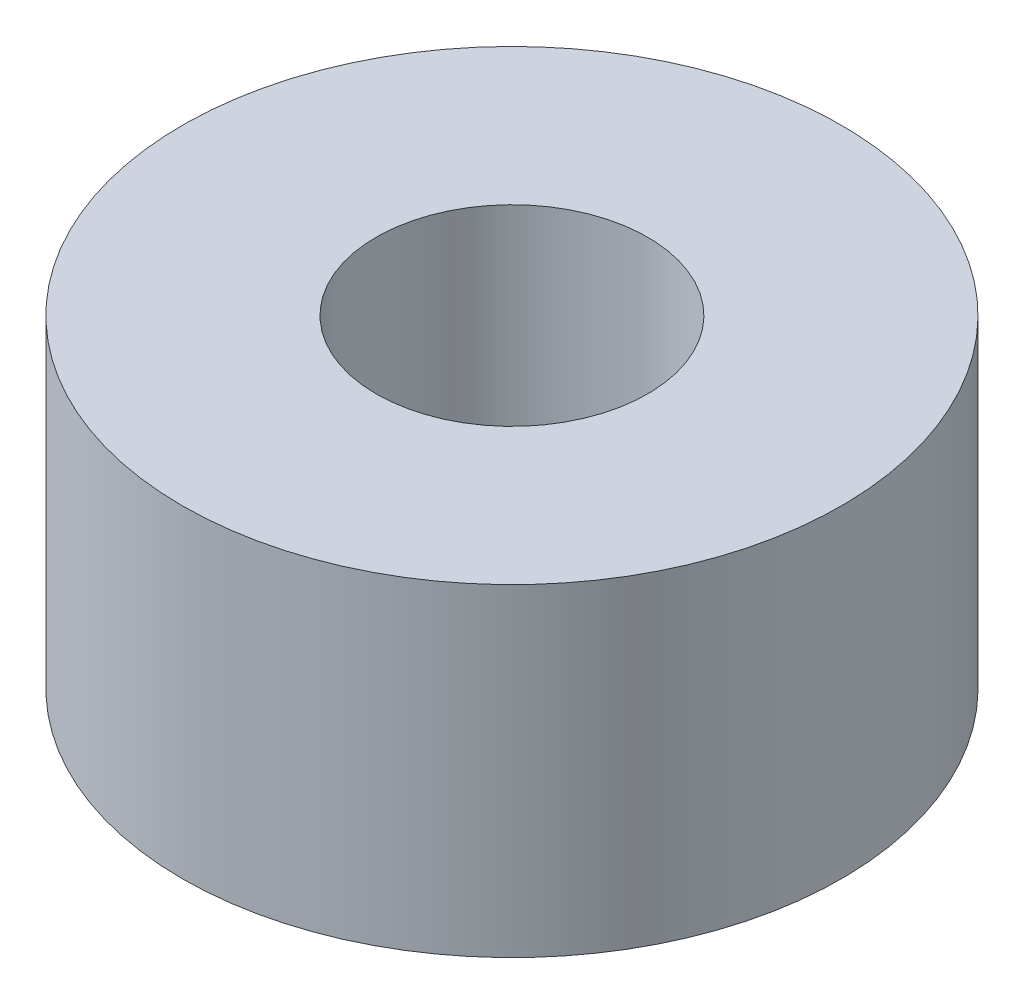
ISO-10303-21;
HEADER;
FILE_DESCRIPTION(('STEP AP214'),'2;1');
FILE_NAME('part.step','',(''),(''),'','','');
FILE_SCHEMA(('AUTOMOTIVE_DESIGN { 1 0 10303 214 1 1 1 1 }'));
ENDSEC;
DATA;
#1=APPLICATION_CONTEXT('core data for automotive mechanical design processes');
#2=APPLICATION_PROTOCOL_DEFINITION('international standard','automotive_design',2000,#1);
#3=PRODUCT_CONTEXT('',#1,'mechanical');
#4=PRODUCT('Part','Part','',(#3));
#5=PRODUCT_RELATED_PRODUCT_CATEGORY('part','',(#4));
#6=PRODUCT_DEFINITION_FORMATION('','',#4);
#7=PRODUCT_DEFINITION_CONTEXT('part definition',#1,'design');
#8=PRODUCT_DEFINITION('design','',#6,#7);
#9=PRODUCT_DEFINITION_SHAPE('','',#8);
#10=(LENGTH_UNIT() NAMED_UNIT(*) SI_UNIT(.MILLI.,.METRE.));
#11=(NAMED_UNIT(*) PLANE_ANGLE_UNIT() SI_UNIT($,.RADIAN.));
#12=(NAMED_UNIT(*) SI_UNIT($,.STERADIAN.) SOLID_ANGLE_UNIT());
#13=UNCERTAINTY_MEASURE_WITH_UNIT(LENGTH_MEASURE(1.E-05),#10,'distance_accuracy_value','');
#14=(GEOMETRIC_REPRESENTATION_CONTEXT(3) GLOBAL_UNCERTAINTY_ASSIGNED_CONTEXT((#13)) GLOBAL_UNIT_ASSIGNED_CONTEXT((#10,
#11,#12)) REPRESENTATION_CONTEXT('',''));
#15=CARTESIAN_POINT('',(0.,0.,0.));
#16=DIRECTION('',(0.,0.,1.));
#17=DIRECTION('',(1.,0.,0.));
#18=AXIS2_PLACEMENT_3D('',#15,#16,#17);
#19=CARTESIAN_POINT('',(0.,5.,0.));
#20=DIRECTION('',(0.,1.,0.));
#21=DIRECTION('',(0.,0.,1.));
#22=AXIS2_PLACEMENT_3D('',#19,#20,#21);
#23=PLANE('',#22);
#24=CARTESIAN_POINT('',(0.,5.,0.));
#25=DIRECTION('',(0.,1.,0.));
#26=DIRECTION('',(0.,0.,1.));
#27=AXIS2_PLACEMENT_3D('',#24,#25,#26);
#28=CIRCLE('',#27,5.1016);
#29=CARTESIAN_POINT('',(0.,5.,5.1016));
#30=VERTEX_POINT('',#29);
#31=EDGE_CURVE('E10',#30,#30,#28,.T.);
#32=ORIENTED_EDGE('',*,*,#31,.T.);
#33=EDGE_LOOP('',(#32));
#34=FACE_BOUND('',#33,.T.);
#35=CARTESIAN_POINT('',(0.,5.,0.));
#36=DIRECTION('',(0.,1.,0.));
#37=DIRECTION('',(0.,0.,1.));
#38=AXIS2_PLACEMENT_3D('',#35,#36,#37);
#39=CIRCLE('',#38,2.1016);
#40=CARTESIAN_POINT('',(0.,5.,2.1016));
#41=VERTEX_POINT('',#40);
#42=EDGE_CURVE('E56',#41,#41,#39,.T.);
#43=ORIENTED_EDGE('',*,*,#42,.F.);
#44=EDGE_LOOP('',(#43));
#45=FACE_BOUND('',#44,.T.);
#46=ADVANCED_FACE('F43',(#34,#45),#23,.T.);
#47=CARTESIAN_POINT('',(0.,0.,0.));
#48=DIRECTION('',(0.,1.,0.));
#49=DIRECTION('',(0.,0.,1.));
#50=AXIS2_PLACEMENT_3D('',#47,#48,#49);
#51=PLANE('',#50);
#52=CARTESIAN_POINT('',(0.,0.,0.));
#53=DIRECTION('',(0.,1.,0.));
#54=DIRECTION('',(0.,0.,1.));
#55=AXIS2_PLACEMENT_3D('',#52,#53,#54);
#56=CIRCLE('',#55,5.1016);
#57=CARTESIAN_POINT('',(0.,0.,5.1016));
#58=VERTEX_POINT('',#57);
#59=EDGE_CURVE('E47',#58,#58,#56,.T.);
#60=ORIENTED_EDGE('',*,*,#59,.F.);
#61=EDGE_LOOP('',(#60));
#62=FACE_BOUND('',#61,.T.);
#63=CARTESIAN_POINT('',(0.,0.,0.));
#64=DIRECTION('',(0.,1.,0.));
#65=DIRECTION('',(0.,0.,1.));
#66=AXIS2_PLACEMENT_3D('',#63,#64,#65);
#67=CIRCLE('',#66,2.1016);
#68=CARTESIAN_POINT('',(0.,0.,2.1016));
#69=VERTEX_POINT('',#68);
#70=EDGE_CURVE('E58',#69,#69,#67,.T.);
#71=ORIENTED_EDGE('',*,*,#70,.T.);
#72=EDGE_LOOP('',(#71));
#73=FACE_BOUND('',#72,.T.);
#74=ADVANCED_FACE('F70',(#62,#73),#51,.F.);
#75=CARTESIAN_POINT('',(0.,5.,0.));
#76=DIRECTION('',(0.,-1.,0.));
#77=DIRECTION('',(0.,0.,-1.));
#78=AXIS2_PLACEMENT_3D('',#75,#76,#77);
#79=CYLINDRICAL_SURFACE('',#78,5.1016);
#80=ORIENTED_EDGE('',*,*,#31,.F.);
#81=EDGE_LOOP('',(#80));
#82=FACE_BOUND('',#81,.T.);
#83=ORIENTED_EDGE('',*,*,#59,.T.);
#84=EDGE_LOOP('',(#83));
#85=FACE_BOUND('',#84,.T.);
#86=ADVANCED_FACE('F45',(#82,#85),#79,.T.);
#87=CARTESIAN_POINT('',(0.,5.,0.));
#88=DIRECTION('',(0.,-1.,0.));
#89=DIRECTION('',(0.,0.,-1.));
#90=AXIS2_PLACEMENT_3D('',#87,#88,#89);
#91=CYLINDRICAL_SURFACE('',#90,2.1016);
#92=ORIENTED_EDGE('',*,*,#42,.T.);
#93=EDGE_LOOP('',(#92));
#94=FACE_BOUND('',#93,.T.);
#95=ORIENTED_EDGE('',*,*,#70,.F.);
#96=EDGE_LOOP('',(#95));
#97=FACE_BOUND('',#96,.T.);
#98=ADVANCED_FACE('F66',(#94,#97),#91,.F.);
#99=CLOSED_SHELL('',(#46,#74,#86,#98));
#100=MANIFOLD_SOLID_BREP('B2',#99);
#101=ADVANCED_BREP_SHAPE_REPRESENTATION('',(#18,#100),#14);
#102=SHAPE_DEFINITION_REPRESENTATION(#9,#101);
ENDSEC;
END-ISO-10303-21;
